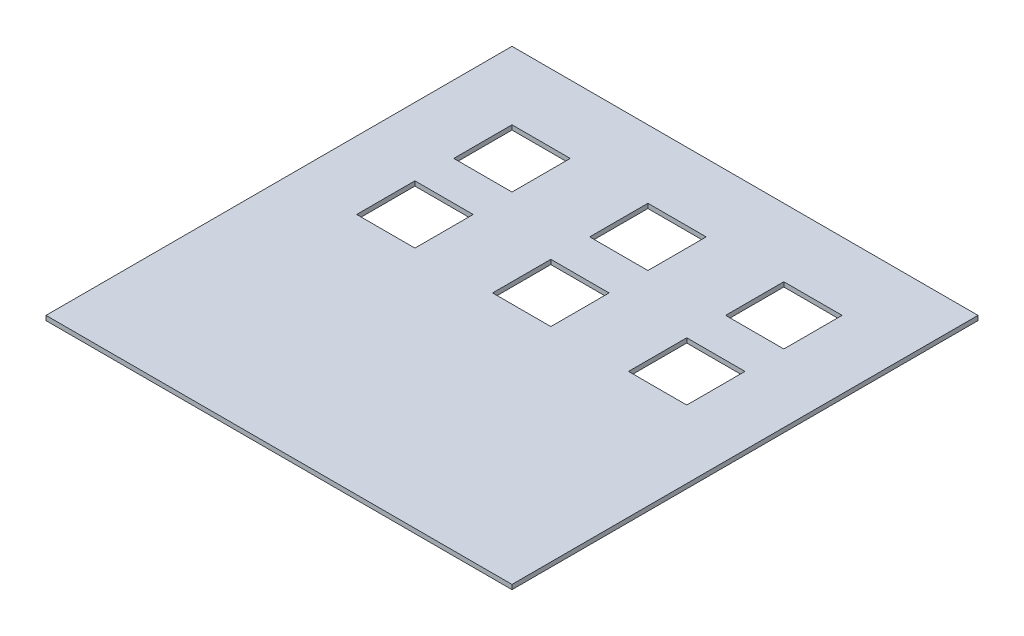
ISO-10303-21;
HEADER;
FILE_DESCRIPTION(('STEP AP214'),'2;1');
FILE_NAME('part.step','',(''),(''),'','','');
FILE_SCHEMA(('AUTOMOTIVE_DESIGN { 1 0 10303 214 1 1 1 1 }'));
ENDSEC;
DATA;
#1=APPLICATION_CONTEXT('core data for automotive mechanical design processes');
#2=APPLICATION_PROTOCOL_DEFINITION('international standard','automotive_design',2000,#1);
#3=PRODUCT_CONTEXT('',#1,'mechanical');
#4=PRODUCT('Part','Part','',(#3));
#5=PRODUCT_RELATED_PRODUCT_CATEGORY('part','',(#4));
#6=PRODUCT_DEFINITION_FORMATION('','',#4);
#7=PRODUCT_DEFINITION_CONTEXT('part definition',#1,'design');
#8=PRODUCT_DEFINITION('design','',#6,#7);
#9=PRODUCT_DEFINITION_SHAPE('','',#8);
#10=(LENGTH_UNIT() NAMED_UNIT(*) SI_UNIT(.MILLI.,.METRE.));
#11=(NAMED_UNIT(*) PLANE_ANGLE_UNIT() SI_UNIT($,.RADIAN.));
#12=(NAMED_UNIT(*) SI_UNIT($,.STERADIAN.) SOLID_ANGLE_UNIT());
#13=UNCERTAINTY_MEASURE_WITH_UNIT(LENGTH_MEASURE(1.E-05),#10,'distance_accuracy_value','');
#14=(GEOMETRIC_REPRESENTATION_CONTEXT(3) GLOBAL_UNCERTAINTY_ASSIGNED_CONTEXT((#13)) GLOBAL_UNIT_ASSIGNED_CONTEXT((#10,
#11,#12)) REPRESENTATION_CONTEXT('',''));
#15=CARTESIAN_POINT('',(0.,0.,0.));
#16=DIRECTION('',(0.,0.,1.));
#17=DIRECTION('',(1.,0.,0.));
#18=AXIS2_PLACEMENT_3D('',#15,#16,#17);
#19=CARTESIAN_POINT('',(69.8499999999999,0.,-44.45));
#20=DIRECTION('',(0.,0.,-1.));
#21=DIRECTION('',(-1.,0.,0.));
#22=AXIS2_PLACEMENT_3D('',#19,#20,#21);
#23=PLANE('',#22);
#24=DIRECTION('',(-1.,0.,0.));
#25=VECTOR('',#24,1.);
#26=CARTESIAN_POINT('',(69.8499999999999,2.9972,-44.45));
#27=LINE('',#26,#25);
#28=CARTESIAN_POINT('',(107.95,2.9972,-44.45));
#29=VERTEX_POINT('',#28);
#30=CARTESIAN_POINT('',(69.8499999999999,2.9972,-44.45));
#31=VERTEX_POINT('',#30);
#32=EDGE_CURVE('E507',#29,#31,#27,.T.);
#33=ORIENTED_EDGE('',*,*,#32,.T.);
#34=DIRECTION('',(0.,1.,0.));
#35=VECTOR('',#34,1.);
#36=CARTESIAN_POINT('',(69.8499999999999,0.,-44.45));
#37=LINE('',#36,#35);
#38=CARTESIAN_POINT('',(69.8499999999999,0.,-44.45));
#39=VERTEX_POINT('',#38);
#40=EDGE_CURVE('E11',#39,#31,#37,.T.);
#41=ORIENTED_EDGE('',*,*,#40,.F.);
#42=DIRECTION('',(-1.,0.,0.));
#43=VECTOR('',#42,1.);
#44=CARTESIAN_POINT('',(69.8499999999999,0.,-44.45));
#45=LINE('',#44,#43);
#46=CARTESIAN_POINT('',(107.95,0.,-44.45));
#47=VERTEX_POINT('',#46);
#48=EDGE_CURVE('E513',#47,#39,#45,.T.);
#49=ORIENTED_EDGE('',*,*,#48,.F.);
#50=DIRECTION('',(0.,1.,0.));
#51=VECTOR('',#50,1.);
#52=CARTESIAN_POINT('',(107.95,0.,-44.45));
#53=LINE('',#52,#51);
#54=EDGE_CURVE('E521',#47,#29,#53,.T.);
#55=ORIENTED_EDGE('',*,*,#54,.T.);
#56=EDGE_LOOP('',(#33,#41,#49,#55));
#57=FACE_BOUND('',#56,.T.);
#58=ADVANCED_FACE('F39',(#57),#23,.F.);
#59=CARTESIAN_POINT('',(69.8499999999999,0.,-6.34999999999999));
#60=DIRECTION('',(-1.,0.,0.));
#61=DIRECTION('',(0.,0.,1.));
#62=AXIS2_PLACEMENT_3D('',#59,#60,#61);
#63=PLANE('',#62);
#64=DIRECTION('',(0.,0.,1.));
#65=VECTOR('',#64,1.);
#66=CARTESIAN_POINT('',(69.8499999999999,2.9972,-6.34999999999999));
#67=LINE('',#66,#65);
#68=CARTESIAN_POINT('',(69.8499999999999,2.9972,-6.34999999999999));
#69=VERTEX_POINT('',#68);
#70=EDGE_CURVE('E503',#31,#69,#67,.T.);
#71=ORIENTED_EDGE('',*,*,#70,.T.);
#72=DIRECTION('',(0.,1.,0.));
#73=VECTOR('',#72,1.);
#74=CARTESIAN_POINT('',(69.8499999999999,0.,-6.34999999999999));
#75=LINE('',#74,#73);
#76=CARTESIAN_POINT('',(69.8499999999999,0.,-6.34999999999999));
#77=VERTEX_POINT('',#76);
#78=EDGE_CURVE('E47',#77,#69,#75,.T.);
#79=ORIENTED_EDGE('',*,*,#78,.F.);
#80=DIRECTION('',(0.,0.,1.));
#81=VECTOR('',#80,1.);
#82=CARTESIAN_POINT('',(69.8499999999999,0.,-6.34999999999999));
#83=LINE('',#82,#81);
#84=EDGE_CURVE('E61',#39,#77,#83,.T.);
#85=ORIENTED_EDGE('',*,*,#84,.F.);
#86=ORIENTED_EDGE('',*,*,#40,.T.);
#87=EDGE_LOOP('',(#71,#79,#85,#86));
#88=FACE_BOUND('',#87,.T.);
#89=ADVANCED_FACE('F534',(#88),#63,.F.);
#90=CARTESIAN_POINT('',(69.8499999999999,0.,-6.34999999999999));
#91=DIRECTION('',(0.,0.,1.));
#92=DIRECTION('',(1.,0.,0.));
#93=AXIS2_PLACEMENT_3D('',#90,#91,#92);
#94=PLANE('',#93);
#95=DIRECTION('',(1.,0.,0.));
#96=VECTOR('',#95,1.);
#97=CARTESIAN_POINT('',(69.8499999999999,2.9972,-6.34999999999999));
#98=LINE('',#97,#96);
#99=CARTESIAN_POINT('',(107.95,2.9972,-6.34999999999999));
#100=VERTEX_POINT('',#99);
#101=EDGE_CURVE('E499',#69,#100,#98,.T.);
#102=ORIENTED_EDGE('',*,*,#101,.T.);
#103=DIRECTION('',(0.,1.,0.));
#104=VECTOR('',#103,1.);
#105=CARTESIAN_POINT('',(107.95,0.,-6.34999999999999));
#106=LINE('',#105,#104);
#107=CARTESIAN_POINT('',(107.95,0.,-6.34999999999999));
#108=VERTEX_POINT('',#107);
#109=EDGE_CURVE('E525',#108,#100,#106,.T.);
#110=ORIENTED_EDGE('',*,*,#109,.F.);
#111=DIRECTION('',(1.,0.,0.));
#112=VECTOR('',#111,1.);
#113=CARTESIAN_POINT('',(69.8499999999999,0.,-6.34999999999999));
#114=LINE('',#113,#112);
#115=EDGE_CURVE('E518',#77,#108,#114,.T.);
#116=ORIENTED_EDGE('',*,*,#115,.F.);
#117=ORIENTED_EDGE('',*,*,#78,.T.);
#118=EDGE_LOOP('',(#102,#110,#116,#117));
#119=FACE_BOUND('',#118,.T.);
#120=ADVANCED_FACE('F531',(#119),#94,.F.);
#121=CARTESIAN_POINT('',(107.95,0.,-6.34999999999999));
#122=DIRECTION('',(1.,0.,0.));
#123=DIRECTION('',(0.,0.,-1.));
#124=AXIS2_PLACEMENT_3D('',#121,#122,#123);
#125=PLANE('',#124);
#126=DIRECTION('',(0.,0.,-1.));
#127=VECTOR('',#126,1.);
#128=CARTESIAN_POINT('',(107.95,2.9972,-6.34999999999999));
#129=LINE('',#128,#127);
#130=EDGE_CURVE('E496',#100,#29,#129,.T.);
#131=ORIENTED_EDGE('',*,*,#130,.T.);
#132=ORIENTED_EDGE('',*,*,#54,.F.);
#133=DIRECTION('',(0.,0.,-1.));
#134=VECTOR('',#133,1.);
#135=CARTESIAN_POINT('',(107.95,0.,-6.34999999999999));
#136=LINE('',#135,#134);
#137=EDGE_CURVE('E54',#108,#47,#136,.T.);
#138=ORIENTED_EDGE('',*,*,#137,.F.);
#139=ORIENTED_EDGE('',*,*,#109,.T.);
#140=EDGE_LOOP('',(#131,#132,#138,#139));
#141=FACE_BOUND('',#140,.T.);
#142=ADVANCED_FACE('F540',(#141),#125,.F.);
#143=CARTESIAN_POINT('',(-19.0500000000001,0.,-44.45));
#144=DIRECTION('',(0.,0.,-1.));
#145=DIRECTION('',(-1.,0.,0.));
#146=AXIS2_PLACEMENT_3D('',#143,#144,#145);
#147=PLANE('',#146);
#148=DIRECTION('',(-1.,0.,0.));
#149=VECTOR('',#148,1.);
#150=CARTESIAN_POINT('',(-19.0500000000001,2.9972,-44.45));
#151=LINE('',#150,#149);
#152=CARTESIAN_POINT('',(19.0499999999999,2.9972,-44.45));
#153=VERTEX_POINT('',#152);
#154=CARTESIAN_POINT('',(-19.0500000000001,2.9972,-44.45));
#155=VERTEX_POINT('',#154);
#156=EDGE_CURVE('E463',#153,#155,#151,.T.);
#157=ORIENTED_EDGE('',*,*,#156,.T.);
#158=DIRECTION('',(0.,1.,0.));
#159=VECTOR('',#158,1.);
#160=CARTESIAN_POINT('',(-19.0500000000001,0.,-44.45));
#161=LINE('',#160,#159);
#162=CARTESIAN_POINT('',(-19.0500000000001,0.,-44.45));
#163=VERTEX_POINT('',#162);
#164=EDGE_CURVE('E492',#163,#155,#161,.T.);
#165=ORIENTED_EDGE('',*,*,#164,.F.);
#166=DIRECTION('',(-1.,0.,0.));
#167=VECTOR('',#166,1.);
#168=CARTESIAN_POINT('',(-19.0500000000001,0.,-44.45));
#169=LINE('',#168,#167);
#170=CARTESIAN_POINT('',(19.0499999999999,0.,-44.45));
#171=VERTEX_POINT('',#170);
#172=EDGE_CURVE('E470',#171,#163,#169,.T.);
#173=ORIENTED_EDGE('',*,*,#172,.F.);
#174=DIRECTION('',(0.,1.,0.));
#175=VECTOR('',#174,1.);
#176=CARTESIAN_POINT('',(19.0499999999999,0.,-44.45));
#177=LINE('',#176,#175);
#178=EDGE_CURVE('E480',#171,#153,#177,.T.);
#179=ORIENTED_EDGE('',*,*,#178,.T.);
#180=EDGE_LOOP('',(#157,#165,#173,#179));
#181=FACE_BOUND('',#180,.T.);
#182=ADVANCED_FACE('F542',(#181),#147,.F.);
#183=CARTESIAN_POINT('',(-19.0500000000001,0.,-6.34999999999999));
#184=DIRECTION('',(-1.,0.,0.));
#185=DIRECTION('',(0.,0.,1.));
#186=AXIS2_PLACEMENT_3D('',#183,#184,#185);
#187=PLANE('',#186);
#188=DIRECTION('',(0.,0.,1.));
#189=VECTOR('',#188,1.);
#190=CARTESIAN_POINT('',(-19.0500000000001,2.9972,-6.34999999999999));
#191=LINE('',#190,#189);
#192=CARTESIAN_POINT('',(-19.0500000000001,2.9972,-6.34999999999999));
#193=VERTEX_POINT('',#192);
#194=EDGE_CURVE('E459',#155,#193,#191,.T.);
#195=ORIENTED_EDGE('',*,*,#194,.T.);
#196=DIRECTION('',(0.,1.,0.));
#197=VECTOR('',#196,1.);
#198=CARTESIAN_POINT('',(-19.0500000000001,0.,-6.34999999999999));
#199=LINE('',#198,#197);
#200=CARTESIAN_POINT('',(-19.0500000000001,0.,-6.34999999999999));
#201=VERTEX_POINT('',#200);
#202=EDGE_CURVE('E488',#201,#193,#199,.T.);
#203=ORIENTED_EDGE('',*,*,#202,.F.);
#204=DIRECTION('',(0.,0.,1.));
#205=VECTOR('',#204,1.);
#206=CARTESIAN_POINT('',(-19.0500000000001,0.,-6.34999999999999));
#207=LINE('',#206,#205);
#208=EDGE_CURVE('E473',#163,#201,#207,.T.);
#209=ORIENTED_EDGE('',*,*,#208,.F.);
#210=ORIENTED_EDGE('',*,*,#164,.T.);
#211=EDGE_LOOP('',(#195,#203,#209,#210));
#212=FACE_BOUND('',#211,.T.);
#213=ADVANCED_FACE('F548',(#212),#187,.F.);
#214=CARTESIAN_POINT('',(-19.0500000000001,0.,-6.34999999999999));
#215=DIRECTION('',(0.,0.,1.));
#216=DIRECTION('',(1.,0.,0.));
#217=AXIS2_PLACEMENT_3D('',#214,#215,#216);
#218=PLANE('',#217);
#219=DIRECTION('',(1.,0.,0.));
#220=VECTOR('',#219,1.);
#221=CARTESIAN_POINT('',(-19.0500000000001,2.9972,-6.34999999999999));
#222=LINE('',#221,#220);
#223=CARTESIAN_POINT('',(19.0499999999999,2.9972,-6.34999999999999));
#224=VERTEX_POINT('',#223);
#225=EDGE_CURVE('E455',#193,#224,#222,.T.);
#226=ORIENTED_EDGE('',*,*,#225,.T.);
#227=DIRECTION('',(0.,1.,0.));
#228=VECTOR('',#227,1.);
#229=CARTESIAN_POINT('',(19.0499999999999,0.,-6.34999999999999));
#230=LINE('',#229,#228);
#231=CARTESIAN_POINT('',(19.0499999999999,0.,-6.34999999999999));
#232=VERTEX_POINT('',#231);
#233=EDGE_CURVE('E484',#232,#224,#230,.T.);
#234=ORIENTED_EDGE('',*,*,#233,.F.);
#235=DIRECTION('',(1.,0.,0.));
#236=VECTOR('',#235,1.);
#237=CARTESIAN_POINT('',(-19.0500000000001,0.,-6.34999999999999));
#238=LINE('',#237,#236);
#239=EDGE_CURVE('E476',#201,#232,#238,.T.);
#240=ORIENTED_EDGE('',*,*,#239,.F.);
#241=ORIENTED_EDGE('',*,*,#202,.T.);
#242=EDGE_LOOP('',(#226,#234,#240,#241));
#243=FACE_BOUND('',#242,.T.);
#244=ADVANCED_FACE('F581',(#243),#218,.F.);
#245=CARTESIAN_POINT('',(19.0499999999999,0.,-6.34999999999999));
#246=DIRECTION('',(1.,0.,0.));
#247=DIRECTION('',(0.,0.,-1.));
#248=AXIS2_PLACEMENT_3D('',#245,#246,#247);
#249=PLANE('',#248);
#250=DIRECTION('',(0.,0.,-1.));
#251=VECTOR('',#250,1.);
#252=CARTESIAN_POINT('',(19.0499999999999,2.9972,-6.34999999999999));
#253=LINE('',#252,#251);
#254=EDGE_CURVE('E452',#224,#153,#253,.T.);
#255=ORIENTED_EDGE('',*,*,#254,.T.);
#256=ORIENTED_EDGE('',*,*,#178,.F.);
#257=DIRECTION('',(0.,0.,-1.));
#258=VECTOR('',#257,1.);
#259=CARTESIAN_POINT('',(19.0499999999999,0.,-6.34999999999999));
#260=LINE('',#259,#258);
#261=EDGE_CURVE('E467',#232,#171,#260,.T.);
#262=ORIENTED_EDGE('',*,*,#261,.F.);
#263=ORIENTED_EDGE('',*,*,#233,.T.);
#264=EDGE_LOOP('',(#255,#256,#262,#263));
#265=FACE_BOUND('',#264,.T.);
#266=ADVANCED_FACE('F591',(#265),#249,.F.);
#267=CARTESIAN_POINT('',(-107.95,0.,-44.45));
#268=DIRECTION('',(0.,0.,-1.));
#269=DIRECTION('',(-1.,0.,0.));
#270=AXIS2_PLACEMENT_3D('',#267,#268,#269);
#271=PLANE('',#270);
#272=DIRECTION('',(-1.,0.,0.));
#273=VECTOR('',#272,1.);
#274=CARTESIAN_POINT('',(-107.95,2.9972,-44.45));
#275=LINE('',#274,#273);
#276=CARTESIAN_POINT('',(-69.8500000000001,2.9972,-44.45));
#277=VERTEX_POINT('',#276);
#278=CARTESIAN_POINT('',(-107.95,2.9972,-44.45));
#279=VERTEX_POINT('',#278);
#280=EDGE_CURVE('E419',#277,#279,#275,.T.);
#281=ORIENTED_EDGE('',*,*,#280,.T.);
#282=DIRECTION('',(0.,1.,0.));
#283=VECTOR('',#282,1.);
#284=CARTESIAN_POINT('',(-107.95,0.,-44.45));
#285=LINE('',#284,#283);
#286=CARTESIAN_POINT('',(-107.95,0.,-44.45));
#287=VERTEX_POINT('',#286);
#288=EDGE_CURVE('E448',#287,#279,#285,.T.);
#289=ORIENTED_EDGE('',*,*,#288,.F.);
#290=DIRECTION('',(-1.,0.,0.));
#291=VECTOR('',#290,1.);
#292=CARTESIAN_POINT('',(-107.95,0.,-44.45));
#293=LINE('',#292,#291);
#294=CARTESIAN_POINT('',(-69.8500000000001,0.,-44.45));
#295=VERTEX_POINT('',#294);
#296=EDGE_CURVE('E426',#295,#287,#293,.T.);
#297=ORIENTED_EDGE('',*,*,#296,.F.);
#298=DIRECTION('',(0.,1.,0.));
#299=VECTOR('',#298,1.);
#300=CARTESIAN_POINT('',(-69.8500000000001,0.,-44.45));
#301=LINE('',#300,#299);
#302=EDGE_CURVE('E436',#295,#277,#301,.T.);
#303=ORIENTED_EDGE('',*,*,#302,.T.);
#304=EDGE_LOOP('',(#281,#289,#297,#303));
#305=FACE_BOUND('',#304,.T.);
#306=ADVANCED_FACE('F601',(#305),#271,.F.);
#307=CARTESIAN_POINT('',(-107.95,0.,-6.34999999999999));
#308=DIRECTION('',(-1.,0.,0.));
#309=DIRECTION('',(0.,0.,1.));
#310=AXIS2_PLACEMENT_3D('',#307,#308,#309);
#311=PLANE('',#310);
#312=DIRECTION('',(0.,0.,1.));
#313=VECTOR('',#312,1.);
#314=CARTESIAN_POINT('',(-107.95,2.9972,-6.34999999999999));
#315=LINE('',#314,#313);
#316=CARTESIAN_POINT('',(-107.95,2.9972,-6.34999999999999));
#317=VERTEX_POINT('',#316);
#318=EDGE_CURVE('E415',#279,#317,#315,.T.);
#319=ORIENTED_EDGE('',*,*,#318,.T.);
#320=DIRECTION('',(0.,1.,0.));
#321=VECTOR('',#320,1.);
#322=CARTESIAN_POINT('',(-107.95,0.,-6.34999999999999));
#323=LINE('',#322,#321);
#324=CARTESIAN_POINT('',(-107.95,0.,-6.34999999999999));
#325=VERTEX_POINT('',#324);
#326=EDGE_CURVE('E444',#325,#317,#323,.T.);
#327=ORIENTED_EDGE('',*,*,#326,.F.);
#328=DIRECTION('',(0.,0.,1.));
#329=VECTOR('',#328,1.);
#330=CARTESIAN_POINT('',(-107.95,0.,-6.34999999999999));
#331=LINE('',#330,#329);
#332=EDGE_CURVE('E429',#287,#325,#331,.T.);
#333=ORIENTED_EDGE('',*,*,#332,.F.);
#334=ORIENTED_EDGE('',*,*,#288,.T.);
#335=EDGE_LOOP('',(#319,#327,#333,#334));
#336=FACE_BOUND('',#335,.T.);
#337=ADVANCED_FACE('F611',(#336),#311,.F.);
#338=CARTESIAN_POINT('',(-107.95,0.,-6.34999999999999));
#339=DIRECTION('',(0.,0.,1.));
#340=DIRECTION('',(1.,0.,0.));
#341=AXIS2_PLACEMENT_3D('',#338,#339,#340);
#342=PLANE('',#341);
#343=DIRECTION('',(1.,0.,0.));
#344=VECTOR('',#343,1.);
#345=CARTESIAN_POINT('',(-107.95,2.9972,-6.34999999999999));
#346=LINE('',#345,#344);
#347=CARTESIAN_POINT('',(-69.8500000000001,2.9972,-6.34999999999999));
#348=VERTEX_POINT('',#347);
#349=EDGE_CURVE('E411',#317,#348,#346,.T.);
#350=ORIENTED_EDGE('',*,*,#349,.T.);
#351=DIRECTION('',(0.,1.,0.));
#352=VECTOR('',#351,1.);
#353=CARTESIAN_POINT('',(-69.8500000000001,0.,-6.34999999999999));
#354=LINE('',#353,#352);
#355=CARTESIAN_POINT('',(-69.8500000000001,0.,-6.34999999999999));
#356=VERTEX_POINT('',#355);
#357=EDGE_CURVE('E440',#356,#348,#354,.T.);
#358=ORIENTED_EDGE('',*,*,#357,.F.);
#359=DIRECTION('',(1.,0.,0.));
#360=VECTOR('',#359,1.);
#361=CARTESIAN_POINT('',(-107.95,0.,-6.34999999999999));
#362=LINE('',#361,#360);
#363=EDGE_CURVE('E432',#325,#356,#362,.T.);
#364=ORIENTED_EDGE('',*,*,#363,.F.);
#365=ORIENTED_EDGE('',*,*,#326,.T.);
#366=EDGE_LOOP('',(#350,#358,#364,#365));
#367=FACE_BOUND('',#366,.T.);
#368=ADVANCED_FACE('F621',(#367),#342,.F.);
#369=CARTESIAN_POINT('',(-69.8500000000001,0.,-6.34999999999999));
#370=DIRECTION('',(1.,0.,0.));
#371=DIRECTION('',(0.,0.,-1.));
#372=AXIS2_PLACEMENT_3D('',#369,#370,#371);
#373=PLANE('',#372);
#374=DIRECTION('',(0.,0.,-1.));
#375=VECTOR('',#374,1.);
#376=CARTESIAN_POINT('',(-69.8500000000001,2.9972,-6.34999999999999));
#377=LINE('',#376,#375);
#378=EDGE_CURVE('E408',#348,#277,#377,.T.);
#379=ORIENTED_EDGE('',*,*,#378,.T.);
#380=ORIENTED_EDGE('',*,*,#302,.F.);
#381=DIRECTION('',(0.,0.,-1.));
#382=VECTOR('',#381,1.);
#383=CARTESIAN_POINT('',(-69.8500000000001,0.,-6.34999999999999));
#384=LINE('',#383,#382);
#385=EDGE_CURVE('E423',#356,#295,#384,.T.);
#386=ORIENTED_EDGE('',*,*,#385,.F.);
#387=ORIENTED_EDGE('',*,*,#357,.T.);
#388=EDGE_LOOP('',(#379,#380,#386,#387));
#389=FACE_BOUND('',#388,.T.);
#390=ADVANCED_FACE('F631',(#389),#373,.F.);
#391=CARTESIAN_POINT('',(69.8499999999999,0.,-107.95));
#392=DIRECTION('',(0.,0.,-1.));
#393=DIRECTION('',(-1.,0.,0.));
#394=AXIS2_PLACEMENT_3D('',#391,#392,#393);
#395=PLANE('',#394);
#396=DIRECTION('',(-1.,0.,0.));
#397=VECTOR('',#396,1.);
#398=CARTESIAN_POINT('',(69.8499999999999,2.9972,-107.95));
#399=LINE('',#398,#397);
#400=CARTESIAN_POINT('',(107.95,2.9972,-107.95));
#401=VERTEX_POINT('',#400);
#402=CARTESIAN_POINT('',(69.8499999999999,2.9972,-107.95));
#403=VERTEX_POINT('',#402);
#404=EDGE_CURVE('E375',#401,#403,#399,.T.);
#405=ORIENTED_EDGE('',*,*,#404,.T.);
#406=DIRECTION('',(0.,1.,0.));
#407=VECTOR('',#406,1.);
#408=CARTESIAN_POINT('',(69.8499999999999,0.,-107.95));
#409=LINE('',#408,#407);
#410=CARTESIAN_POINT('',(69.8499999999999,0.,-107.95));
#411=VERTEX_POINT('',#410);
#412=EDGE_CURVE('E404',#411,#403,#409,.T.);
#413=ORIENTED_EDGE('',*,*,#412,.F.);
#414=DIRECTION('',(-1.,0.,0.));
#415=VECTOR('',#414,1.);
#416=CARTESIAN_POINT('',(69.8499999999999,0.,-107.95));
#417=LINE('',#416,#415);
#418=CARTESIAN_POINT('',(107.95,0.,-107.95));
#419=VERTEX_POINT('',#418);
#420=EDGE_CURVE('E382',#419,#411,#417,.T.);
#421=ORIENTED_EDGE('',*,*,#420,.F.);
#422=DIRECTION('',(0.,1.,0.));
#423=VECTOR('',#422,1.);
#424=CARTESIAN_POINT('',(107.95,0.,-107.95));
#425=LINE('',#424,#423);
#426=EDGE_CURVE('E392',#419,#401,#425,.T.);
#427=ORIENTED_EDGE('',*,*,#426,.T.);
#428=EDGE_LOOP('',(#405,#413,#421,#427));
#429=FACE_BOUND('',#428,.T.);
#430=ADVANCED_FACE('F641',(#429),#395,.F.);
#431=CARTESIAN_POINT('',(69.8499999999999,0.,-69.85));
#432=DIRECTION('',(-1.,0.,0.));
#433=DIRECTION('',(0.,0.,1.));
#434=AXIS2_PLACEMENT_3D('',#431,#432,#433);
#435=PLANE('',#434);
#436=DIRECTION('',(0.,0.,1.));
#437=VECTOR('',#436,1.);
#438=CARTESIAN_POINT('',(69.8499999999999,2.9972,-69.85));
#439=LINE('',#438,#437);
#440=CARTESIAN_POINT('',(69.8499999999999,2.9972,-69.85));
#441=VERTEX_POINT('',#440);
#442=EDGE_CURVE('E371',#403,#441,#439,.T.);
#443=ORIENTED_EDGE('',*,*,#442,.T.);
#444=DIRECTION('',(0.,1.,0.));
#445=VECTOR('',#444,1.);
#446=CARTESIAN_POINT('',(69.8499999999999,0.,-69.85));
#447=LINE('',#446,#445);
#448=CARTESIAN_POINT('',(69.8499999999999,0.,-69.85));
#449=VERTEX_POINT('',#448);
#450=EDGE_CURVE('E400',#449,#441,#447,.T.);
#451=ORIENTED_EDGE('',*,*,#450,.F.);
#452=DIRECTION('',(0.,0.,1.));
#453=VECTOR('',#452,1.);
#454=CARTESIAN_POINT('',(69.8499999999999,0.,-69.85));
#455=LINE('',#454,#453);
#456=EDGE_CURVE('E385',#411,#449,#455,.T.);
#457=ORIENTED_EDGE('',*,*,#456,.F.);
#458=ORIENTED_EDGE('',*,*,#412,.T.);
#459=EDGE_LOOP('',(#443,#451,#457,#458));
#460=FACE_BOUND('',#459,.T.);
#461=ADVANCED_FACE('F651',(#460),#435,.F.);
#462=CARTESIAN_POINT('',(69.8499999999999,0.,-69.85));
#463=DIRECTION('',(0.,0.,1.));
#464=DIRECTION('',(1.,0.,0.));
#465=AXIS2_PLACEMENT_3D('',#462,#463,#464);
#466=PLANE('',#465);
#467=DIRECTION('',(1.,0.,0.));
#468=VECTOR('',#467,1.);
#469=CARTESIAN_POINT('',(69.8499999999999,2.9972,-69.85));
#470=LINE('',#469,#468);
#471=CARTESIAN_POINT('',(107.95,2.9972,-69.85));
#472=VERTEX_POINT('',#471);
#473=EDGE_CURVE('E367',#441,#472,#470,.T.);
#474=ORIENTED_EDGE('',*,*,#473,.T.);
#475=DIRECTION('',(0.,1.,0.));
#476=VECTOR('',#475,1.);
#477=CARTESIAN_POINT('',(107.95,0.,-69.85));
#478=LINE('',#477,#476);
#479=CARTESIAN_POINT('',(107.95,0.,-69.85));
#480=VERTEX_POINT('',#479);
#481=EDGE_CURVE('E396',#480,#472,#478,.T.);
#482=ORIENTED_EDGE('',*,*,#481,.F.);
#483=DIRECTION('',(1.,0.,0.));
#484=VECTOR('',#483,1.);
#485=CARTESIAN_POINT('',(69.8499999999999,0.,-69.85));
#486=LINE('',#485,#484);
#487=EDGE_CURVE('E388',#449,#480,#486,.T.);
#488=ORIENTED_EDGE('',*,*,#487,.F.);
#489=ORIENTED_EDGE('',*,*,#450,.T.);
#490=EDGE_LOOP('',(#474,#482,#488,#489));
#491=FACE_BOUND('',#490,.T.);
#492=ADVANCED_FACE('F661',(#491),#466,.F.);
#493=CARTESIAN_POINT('',(107.95,0.,-69.85));
#494=DIRECTION('',(1.,0.,0.));
#495=DIRECTION('',(0.,0.,-1.));
#496=AXIS2_PLACEMENT_3D('',#493,#494,#495);
#497=PLANE('',#496);
#498=DIRECTION('',(0.,0.,-1.));
#499=VECTOR('',#498,1.);
#500=CARTESIAN_POINT('',(107.95,2.9972,-69.85));
#501=LINE('',#500,#499);
#502=EDGE_CURVE('E364',#472,#401,#501,.T.);
#503=ORIENTED_EDGE('',*,*,#502,.T.);
#504=ORIENTED_EDGE('',*,*,#426,.F.);
#505=DIRECTION('',(0.,0.,-1.));
#506=VECTOR('',#505,1.);
#507=CARTESIAN_POINT('',(107.95,0.,-69.85));
#508=LINE('',#507,#506);
#509=EDGE_CURVE('E379',#480,#419,#508,.T.);
#510=ORIENTED_EDGE('',*,*,#509,.F.);
#511=ORIENTED_EDGE('',*,*,#481,.T.);
#512=EDGE_LOOP('',(#503,#504,#510,#511));
#513=FACE_BOUND('',#512,.T.);
#514=ADVANCED_FACE('F671',(#513),#497,.F.);
#515=CARTESIAN_POINT('',(152.4,2.9972,152.4));
#516=DIRECTION('',(-1.,0.,0.));
#517=DIRECTION('',(0.,0.,1.));
#518=AXIS2_PLACEMENT_3D('',#515,#516,#517);
#519=PLANE('',#518);
#520=DIRECTION('',(0.,0.,-1.));
#521=VECTOR('',#520,1.);
#522=CARTESIAN_POINT('',(152.4,0.,152.4));
#523=LINE('',#522,#521);
#524=CARTESIAN_POINT('',(152.4,0.,152.4));
#525=VERTEX_POINT('',#524);
#526=CARTESIAN_POINT('',(152.4,0.,-152.4));
#527=VERTEX_POINT('',#526);
#528=EDGE_CURVE('E313',#525,#527,#523,.T.);
#529=ORIENTED_EDGE('',*,*,#528,.T.);
#530=DIRECTION('',(0.,-1.,0.));
#531=VECTOR('',#530,1.);
#532=CARTESIAN_POINT('',(152.4,2.9972,-152.4));
#533=LINE('',#532,#531);
#534=CARTESIAN_POINT('',(152.4,2.9972,-152.4));
#535=VERTEX_POINT('',#534);
#536=EDGE_CURVE('E360',#535,#527,#533,.T.);
#537=ORIENTED_EDGE('',*,*,#536,.F.);
#538=DIRECTION('',(0.,0.,-1.));
#539=VECTOR('',#538,1.);
#540=CARTESIAN_POINT('',(152.4,2.9972,152.4));
#541=LINE('',#540,#539);
#542=CARTESIAN_POINT('',(152.4,2.9972,152.4));
#543=VERTEX_POINT('',#542);
#544=EDGE_CURVE('E323',#543,#535,#541,.T.);
#545=ORIENTED_EDGE('',*,*,#544,.F.);
#546=DIRECTION('',(0.,-1.,0.));
#547=VECTOR('',#546,1.);
#548=CARTESIAN_POINT('',(152.4,2.9972,152.4));
#549=LINE('',#548,#547);
#550=EDGE_CURVE('E337',#543,#525,#549,.T.);
#551=ORIENTED_EDGE('',*,*,#550,.T.);
#552=EDGE_LOOP('',(#529,#537,#545,#551));
#553=FACE_BOUND('',#552,.T.);
#554=ADVANCED_FACE('F681',(#553),#519,.F.);
#555=CARTESIAN_POINT('',(-152.4,2.9972,-152.4));
#556=DIRECTION('',(0.,0.,1.));
#557=DIRECTION('',(1.,0.,0.));
#558=AXIS2_PLACEMENT_3D('',#555,#556,#557);
#559=PLANE('',#558);
#560=DIRECTION('',(-1.,0.,0.));
#561=VECTOR('',#560,1.);
#562=CARTESIAN_POINT('',(-152.4,0.,-152.4));
#563=LINE('',#562,#561);
#564=CARTESIAN_POINT('',(-152.4,0.,-152.4));
#565=VERTEX_POINT('',#564);
#566=EDGE_CURVE('E341',#527,#565,#563,.T.);
#567=ORIENTED_EDGE('',*,*,#566,.T.);
#568=DIRECTION('',(0.,-1.,0.));
#569=VECTOR('',#568,1.);
#570=CARTESIAN_POINT('',(-152.4,2.9972,-152.4));
#571=LINE('',#570,#569);
#572=CARTESIAN_POINT('',(-152.4,2.9972,-152.4));
#573=VERTEX_POINT('',#572);
#574=EDGE_CURVE('E356',#573,#565,#571,.T.);
#575=ORIENTED_EDGE('',*,*,#574,.F.);
#576=DIRECTION('',(-1.,0.,0.));
#577=VECTOR('',#576,1.);
#578=CARTESIAN_POINT('',(-152.4,2.9972,-152.4));
#579=LINE('',#578,#577);
#580=EDGE_CURVE('E327',#535,#573,#579,.T.);
#581=ORIENTED_EDGE('',*,*,#580,.F.);
#582=ORIENTED_EDGE('',*,*,#536,.T.);
#583=EDGE_LOOP('',(#567,#575,#581,#582));
#584=FACE_BOUND('',#583,.T.);
#585=ADVANCED_FACE('F767',(#584),#559,.F.);
#586=CARTESIAN_POINT('',(-152.4,2.9972,152.4));
#587=DIRECTION('',(1.,0.,0.));
#588=DIRECTION('',(0.,0.,-1.));
#589=AXIS2_PLACEMENT_3D('',#586,#587,#588);
#590=PLANE('',#589);
#591=DIRECTION('',(0.,0.,1.));
#592=VECTOR('',#591,1.);
#593=CARTESIAN_POINT('',(-152.4,0.,152.4));
#594=LINE('',#593,#592);
#595=CARTESIAN_POINT('',(-152.4,0.,152.4));
#596=VERTEX_POINT('',#595);
#597=EDGE_CURVE('E344',#565,#596,#594,.T.);
#598=ORIENTED_EDGE('',*,*,#597,.T.);
#599=DIRECTION('',(0.,-1.,0.));
#600=VECTOR('',#599,1.);
#601=CARTESIAN_POINT('',(-152.4,2.9972,152.4));
#602=LINE('',#601,#600);
#603=CARTESIAN_POINT('',(-152.4,2.9972,152.4));
#604=VERTEX_POINT('',#603);
#605=EDGE_CURVE('E352',#604,#596,#602,.T.);
#606=ORIENTED_EDGE('',*,*,#605,.F.);
#607=DIRECTION('',(0.,0.,1.));
#608=VECTOR('',#607,1.);
#609=CARTESIAN_POINT('',(-152.4,2.9972,152.4));
#610=LINE('',#609,#608);
#611=EDGE_CURVE('E331',#573,#604,#610,.T.);
#612=ORIENTED_EDGE('',*,*,#611,.F.);
#613=ORIENTED_EDGE('',*,*,#574,.T.);
#614=EDGE_LOOP('',(#598,#606,#612,#613));
#615=FACE_BOUND('',#614,.T.);
#616=ADVANCED_FACE('F763',(#615),#590,.F.);
#617=CARTESIAN_POINT('',(-152.4,2.9972,152.4));
#618=DIRECTION('',(0.,0.,-1.));
#619=DIRECTION('',(-1.,0.,0.));
#620=AXIS2_PLACEMENT_3D('',#617,#618,#619);
#621=PLANE('',#620);
#622=DIRECTION('',(1.,0.,0.));
#623=VECTOR('',#622,1.);
#624=CARTESIAN_POINT('',(-152.4,0.,152.4));
#625=LINE('',#624,#623);
#626=EDGE_CURVE('E328',#596,#525,#625,.T.);
#627=ORIENTED_EDGE('',*,*,#626,.T.);
#628=ORIENTED_EDGE('',*,*,#550,.F.);
#629=DIRECTION('',(1.,0.,0.));
#630=VECTOR('',#629,1.);
#631=CARTESIAN_POINT('',(-152.4,2.9972,152.4));
#632=LINE('',#631,#630);
#633=EDGE_CURVE('E334',#604,#543,#632,.T.);
#634=ORIENTED_EDGE('',*,*,#633,.F.);
#635=ORIENTED_EDGE('',*,*,#605,.T.);
#636=EDGE_LOOP('',(#627,#628,#634,#635));
#637=FACE_BOUND('',#636,.T.);
#638=ADVANCED_FACE('F694',(#637),#621,.F.);
#639=CARTESIAN_POINT('',(0.,2.9972,0.));
#640=DIRECTION('',(0.,-1.,0.));
#641=DIRECTION('',(0.,0.,-1.));
#642=AXIS2_PLACEMENT_3D('',#639,#640,#641);
#643=PLANE('',#642);
#644=DIRECTION('',(-1.,0.,0.));
#645=VECTOR('',#644,1.);
#646=CARTESIAN_POINT('',(-19.0500000000001,2.9972,-107.95));
#647=LINE('',#646,#645);
#648=CARTESIAN_POINT('',(19.0499999999999,2.9972,-107.95));
#649=VERTEX_POINT('',#648);
#650=CARTESIAN_POINT('',(-19.0500000000001,2.9972,-107.95));
#651=VERTEX_POINT('',#650);
#652=EDGE_CURVE('E226',#649,#651,#647,.T.);
#653=ORIENTED_EDGE('',*,*,#652,.F.);
#654=DIRECTION('',(0.,0.,-1.));
#655=VECTOR('',#654,1.);
#656=CARTESIAN_POINT('',(19.0499999999999,2.9972,-69.85));
#657=LINE('',#656,#655);
#658=CARTESIAN_POINT('',(19.0499999999999,2.9972,-69.85));
#659=VERTEX_POINT('',#658);
#660=EDGE_CURVE('E271',#659,#649,#657,.T.);
#661=ORIENTED_EDGE('',*,*,#660,.F.);
#662=DIRECTION('',(1.,0.,0.));
#663=VECTOR('',#662,1.);
#664=CARTESIAN_POINT('',(-19.0500000000001,2.9972,-69.85));
#665=LINE('',#664,#663);
#666=CARTESIAN_POINT('',(-19.0500000000001,2.9972,-69.85));
#667=VERTEX_POINT('',#666);
#668=EDGE_CURVE('E250',#667,#659,#665,.T.);
#669=ORIENTED_EDGE('',*,*,#668,.F.);
#670=DIRECTION('',(0.,0.,1.));
#671=VECTOR('',#670,1.);
#672=CARTESIAN_POINT('',(-19.0500000000001,2.9972,-69.85));
#673=LINE('',#672,#671);
#674=EDGE_CURVE('E241',#651,#667,#673,.T.);
#675=ORIENTED_EDGE('',*,*,#674,.F.);
#676=EDGE_LOOP('',(#653,#661,#669,#675));
#677=FACE_BOUND('',#676,.T.);
#678=DIRECTION('',(-1.,0.,0.));
#679=VECTOR('',#678,1.);
#680=CARTESIAN_POINT('',(-107.95,2.9972,-107.95));
#681=LINE('',#680,#679);
#682=CARTESIAN_POINT('',(-69.8500000000001,2.9972,-107.95));
#683=VERTEX_POINT('',#682);
#684=CARTESIAN_POINT('',(-107.95,2.9972,-107.95));
#685=VERTEX_POINT('',#684);
#686=EDGE_CURVE('E299',#683,#685,#681,.T.);
#687=ORIENTED_EDGE('',*,*,#686,.F.);
#688=DIRECTION('',(0.,0.,-1.));
#689=VECTOR('',#688,1.);
#690=CARTESIAN_POINT('',(-69.8500000000001,2.9972,-69.85));
#691=LINE('',#690,#689);
#692=CARTESIAN_POINT('',(-69.8500000000001,2.9972,-69.85));
#693=VERTEX_POINT('',#692);
#694=EDGE_CURVE('E278',#693,#683,#691,.T.);
#695=ORIENTED_EDGE('',*,*,#694,.F.);
#696=DIRECTION('',(1.,0.,0.));
#697=VECTOR('',#696,1.);
#698=CARTESIAN_POINT('',(-107.95,2.9972,-69.85));
#699=LINE('',#698,#697);
#700=CARTESIAN_POINT('',(-107.95,2.9972,-69.85));
#701=VERTEX_POINT('',#700);
#702=EDGE_CURVE('E284',#701,#693,#699,.T.);
#703=ORIENTED_EDGE('',*,*,#702,.F.);
#704=DIRECTION('',(0.,0.,1.));
#705=VECTOR('',#704,1.);
#706=CARTESIAN_POINT('',(-107.95,2.9972,-69.85));
#707=LINE('',#706,#705);
#708=EDGE_CURVE('E303',#685,#701,#707,.T.);
#709=ORIENTED_EDGE('',*,*,#708,.F.);
#710=EDGE_LOOP('',(#687,#695,#703,#709));
#711=FACE_BOUND('',#710,.T.);
#712=ORIENTED_EDGE('',*,*,#544,.T.);
#713=ORIENTED_EDGE('',*,*,#580,.T.);
#714=ORIENTED_EDGE('',*,*,#611,.T.);
#715=ORIENTED_EDGE('',*,*,#633,.T.);
#716=EDGE_LOOP('',(#712,#713,#714,#715));
#717=FACE_BOUND('',#716,.T.);
#718=ORIENTED_EDGE('',*,*,#502,.F.);
#719=ORIENTED_EDGE('',*,*,#473,.F.);
#720=ORIENTED_EDGE('',*,*,#442,.F.);
#721=ORIENTED_EDGE('',*,*,#404,.F.);
#722=EDGE_LOOP('',(#718,#719,#720,#721));
#723=FACE_BOUND('',#722,.T.);
#724=ORIENTED_EDGE('',*,*,#378,.F.);
#725=ORIENTED_EDGE('',*,*,#349,.F.);
#726=ORIENTED_EDGE('',*,*,#318,.F.);
#727=ORIENTED_EDGE('',*,*,#280,.F.);
#728=EDGE_LOOP('',(#724,#725,#726,#727));
#729=FACE_BOUND('',#728,.T.);
#730=ORIENTED_EDGE('',*,*,#254,.F.);
#731=ORIENTED_EDGE('',*,*,#225,.F.);
#732=ORIENTED_EDGE('',*,*,#194,.F.);
#733=ORIENTED_EDGE('',*,*,#156,.F.);
#734=EDGE_LOOP('',(#730,#731,#732,#733));
#735=FACE_BOUND('',#734,.T.);
#736=ORIENTED_EDGE('',*,*,#130,.F.);
#737=ORIENTED_EDGE('',*,*,#101,.F.);
#738=ORIENTED_EDGE('',*,*,#70,.F.);
#739=ORIENTED_EDGE('',*,*,#32,.F.);
#740=EDGE_LOOP('',(#736,#737,#738,#739));
#741=FACE_BOUND('',#740,.T.);
#742=ADVANCED_FACE('F248',(#677,#711,#717,#723,#729,#735,#741),#643,.F.);
#743=CARTESIAN_POINT('',(0.,0.,0.));
#744=DIRECTION('',(0.,-1.,0.));
#745=DIRECTION('',(0.,0.,-1.));
#746=AXIS2_PLACEMENT_3D('',#743,#744,#745);
#747=PLANE('',#746);
#748=DIRECTION('',(0.,0.,-1.));
#749=VECTOR('',#748,1.);
#750=CARTESIAN_POINT('',(19.0499999999999,0.,-69.85));
#751=LINE('',#750,#749);
#752=CARTESIAN_POINT('',(19.0499999999999,0.,-69.85));
#753=VERTEX_POINT('',#752);
#754=CARTESIAN_POINT('',(19.0499999999999,0.,-107.95));
#755=VERTEX_POINT('',#754);
#756=EDGE_CURVE('E274',#753,#755,#751,.T.);
#757=ORIENTED_EDGE('',*,*,#756,.T.);
#758=DIRECTION('',(-1.,0.,0.));
#759=VECTOR('',#758,1.);
#760=CARTESIAN_POINT('',(-19.0500000000001,0.,-107.95));
#761=LINE('',#760,#759);
#762=CARTESIAN_POINT('',(-19.0500000000001,0.,-107.95));
#763=VERTEX_POINT('',#762);
#764=EDGE_CURVE('E237',#755,#763,#761,.T.);
#765=ORIENTED_EDGE('',*,*,#764,.T.);
#766=DIRECTION('',(0.,0.,1.));
#767=VECTOR('',#766,1.);
#768=CARTESIAN_POINT('',(-19.0500000000001,0.,-69.85));
#769=LINE('',#768,#767);
#770=CARTESIAN_POINT('',(-19.0500000000001,0.,-69.85));
#771=VERTEX_POINT('',#770);
#772=EDGE_CURVE('E244',#763,#771,#769,.T.);
#773=ORIENTED_EDGE('',*,*,#772,.T.);
#774=DIRECTION('',(1.,0.,0.));
#775=VECTOR('',#774,1.);
#776=CARTESIAN_POINT('',(-19.0500000000001,0.,-69.85));
#777=LINE('',#776,#775);
#778=EDGE_CURVE('E267',#771,#753,#777,.T.);
#779=ORIENTED_EDGE('',*,*,#778,.T.);
#780=EDGE_LOOP('',(#757,#765,#773,#779));
#781=FACE_BOUND('',#780,.T.);
#782=DIRECTION('',(0.,0.,-1.));
#783=VECTOR('',#782,1.);
#784=CARTESIAN_POINT('',(-69.8500000000001,0.,-69.85));
#785=LINE('',#784,#783);
#786=CARTESIAN_POINT('',(-69.8500000000001,0.,-69.85));
#787=VERTEX_POINT('',#786);
#788=CARTESIAN_POINT('',(-69.8500000000001,0.,-107.95));
#789=VERTEX_POINT('',#788);
#790=EDGE_CURVE('E279',#787,#789,#785,.T.);
#791=ORIENTED_EDGE('',*,*,#790,.T.);
#792=DIRECTION('',(-1.,0.,0.));
#793=VECTOR('',#792,1.);
#794=CARTESIAN_POINT('',(-107.95,0.,-107.95));
#795=LINE('',#794,#793);
#796=CARTESIAN_POINT('',(-107.95,0.,-107.95));
#797=VERTEX_POINT('',#796);
#798=EDGE_CURVE('E283',#789,#797,#795,.T.);
#799=ORIENTED_EDGE('',*,*,#798,.T.);
#800=DIRECTION('',(0.,0.,1.));
#801=VECTOR('',#800,1.);
#802=CARTESIAN_POINT('',(-107.95,0.,-69.85));
#803=LINE('',#802,#801);
#804=CARTESIAN_POINT('',(-107.95,0.,-69.85));
#805=VERTEX_POINT('',#804);
#806=EDGE_CURVE('E288',#797,#805,#803,.T.);
#807=ORIENTED_EDGE('',*,*,#806,.T.);
#808=DIRECTION('',(1.,0.,0.));
#809=VECTOR('',#808,1.);
#810=CARTESIAN_POINT('',(-107.95,0.,-69.85));
#811=LINE('',#810,#809);
#812=EDGE_CURVE('E292',#805,#787,#811,.T.);
#813=ORIENTED_EDGE('',*,*,#812,.T.);
#814=EDGE_LOOP('',(#791,#799,#807,#813));
#815=FACE_BOUND('',#814,.T.);
#816=ORIENTED_EDGE('',*,*,#528,.F.);
#817=ORIENTED_EDGE('',*,*,#626,.F.);
#818=ORIENTED_EDGE('',*,*,#597,.F.);
#819=ORIENTED_EDGE('',*,*,#566,.F.);
#820=EDGE_LOOP('',(#816,#817,#818,#819));
#821=FACE_BOUND('',#820,.T.);
#822=ORIENTED_EDGE('',*,*,#509,.T.);
#823=ORIENTED_EDGE('',*,*,#420,.T.);
#824=ORIENTED_EDGE('',*,*,#456,.T.);
#825=ORIENTED_EDGE('',*,*,#487,.T.);
#826=EDGE_LOOP('',(#822,#823,#824,#825));
#827=FACE_BOUND('',#826,.T.);
#828=ORIENTED_EDGE('',*,*,#385,.T.);
#829=ORIENTED_EDGE('',*,*,#296,.T.);
#830=ORIENTED_EDGE('',*,*,#332,.T.);
#831=ORIENTED_EDGE('',*,*,#363,.T.);
#832=EDGE_LOOP('',(#828,#829,#830,#831));
#833=FACE_BOUND('',#832,.T.);
#834=ORIENTED_EDGE('',*,*,#261,.T.);
#835=ORIENTED_EDGE('',*,*,#172,.T.);
#836=ORIENTED_EDGE('',*,*,#208,.T.);
#837=ORIENTED_EDGE('',*,*,#239,.T.);
#838=EDGE_LOOP('',(#834,#835,#836,#837));
#839=FACE_BOUND('',#838,.T.);
#840=ORIENTED_EDGE('',*,*,#137,.T.);
#841=ORIENTED_EDGE('',*,*,#48,.T.);
#842=ORIENTED_EDGE('',*,*,#84,.T.);
#843=ORIENTED_EDGE('',*,*,#115,.T.);
#844=EDGE_LOOP('',(#840,#841,#842,#843));
#845=FACE_BOUND('',#844,.T.);
#846=ADVANCED_FACE('F693',(#781,#815,#821,#827,#833,#839,#845),#747,.T.);
#847=CARTESIAN_POINT('',(-69.8500000000001,0.,-69.85));
#848=DIRECTION('',(1.,0.,0.));
#849=DIRECTION('',(0.,0.,-1.));
#850=AXIS2_PLACEMENT_3D('',#847,#848,#849);
#851=PLANE('',#850);
#852=ORIENTED_EDGE('',*,*,#694,.T.);
#853=DIRECTION('',(0.,1.,0.));
#854=VECTOR('',#853,1.);
#855=CARTESIAN_POINT('',(-69.8500000000001,0.,-107.95));
#856=LINE('',#855,#854);
#857=EDGE_CURVE('E296',#789,#683,#856,.T.);
#858=ORIENTED_EDGE('',*,*,#857,.F.);
#859=ORIENTED_EDGE('',*,*,#790,.F.);
#860=DIRECTION('',(0.,1.,0.));
#861=VECTOR('',#860,1.);
#862=CARTESIAN_POINT('',(-69.8500000000001,0.,-69.85));
#863=LINE('',#862,#861);
#864=EDGE_CURVE('E310',#787,#693,#863,.T.);
#865=ORIENTED_EDGE('',*,*,#864,.T.);
#866=EDGE_LOOP('',(#852,#858,#859,#865));
#867=FACE_BOUND('',#866,.T.);
#868=ADVANCED_FACE('F705',(#867),#851,.F.);
#869=CARTESIAN_POINT('',(-107.95,0.,-69.85));
#870=DIRECTION('',(0.,0.,1.));
#871=DIRECTION('',(1.,0.,0.));
#872=AXIS2_PLACEMENT_3D('',#869,#870,#871);
#873=PLANE('',#872);
#874=ORIENTED_EDGE('',*,*,#702,.T.);
#875=ORIENTED_EDGE('',*,*,#864,.F.);
#876=ORIENTED_EDGE('',*,*,#812,.F.);
#877=DIRECTION('',(0.,1.,0.));
#878=VECTOR('',#877,1.);
#879=CARTESIAN_POINT('',(-107.95,0.,-69.85));
#880=LINE('',#879,#878);
#881=EDGE_CURVE('E314',#805,#701,#880,.T.);
#882=ORIENTED_EDGE('',*,*,#881,.T.);
#883=EDGE_LOOP('',(#874,#875,#876,#882));
#884=FACE_BOUND('',#883,.T.);
#885=ADVANCED_FACE('F750',(#884),#873,.F.);
#886=CARTESIAN_POINT('',(-107.95,0.,-69.85));
#887=DIRECTION('',(-1.,0.,0.));
#888=DIRECTION('',(0.,0.,1.));
#889=AXIS2_PLACEMENT_3D('',#886,#887,#888);
#890=PLANE('',#889);
#891=ORIENTED_EDGE('',*,*,#708,.T.);
#892=ORIENTED_EDGE('',*,*,#881,.F.);
#893=ORIENTED_EDGE('',*,*,#806,.F.);
#894=DIRECTION('',(0.,1.,0.));
#895=VECTOR('',#894,1.);
#896=CARTESIAN_POINT('',(-107.95,0.,-107.95));
#897=LINE('',#896,#895);
#898=EDGE_CURVE('E317',#797,#685,#897,.T.);
#899=ORIENTED_EDGE('',*,*,#898,.T.);
#900=EDGE_LOOP('',(#891,#892,#893,#899));
#901=FACE_BOUND('',#900,.T.);
#902=ADVANCED_FACE('F753',(#901),#890,.F.);
#903=CARTESIAN_POINT('',(-107.95,0.,-107.95));
#904=DIRECTION('',(0.,0.,-1.));
#905=DIRECTION('',(-1.,0.,0.));
#906=AXIS2_PLACEMENT_3D('',#903,#904,#905);
#907=PLANE('',#906);
#908=ORIENTED_EDGE('',*,*,#686,.T.);
#909=ORIENTED_EDGE('',*,*,#898,.F.);
#910=ORIENTED_EDGE('',*,*,#798,.F.);
#911=ORIENTED_EDGE('',*,*,#857,.T.);
#912=EDGE_LOOP('',(#908,#909,#910,#911));
#913=FACE_BOUND('',#912,.T.);
#914=ADVANCED_FACE('F718',(#913),#907,.F.);
#915=CARTESIAN_POINT('',(19.0499999999999,0.,-69.85));
#916=DIRECTION('',(1.,0.,0.));
#917=DIRECTION('',(0.,0.,-1.));
#918=AXIS2_PLACEMENT_3D('',#915,#916,#917);
#919=PLANE('',#918);
#920=ORIENTED_EDGE('',*,*,#660,.T.);
#921=DIRECTION('',(0.,1.,0.));
#922=VECTOR('',#921,1.);
#923=CARTESIAN_POINT('',(19.0499999999999,0.,-107.95));
#924=LINE('',#923,#922);
#925=EDGE_CURVE('E232',#755,#649,#924,.T.);
#926=ORIENTED_EDGE('',*,*,#925,.F.);
#927=ORIENTED_EDGE('',*,*,#756,.F.);
#928=DIRECTION('',(0.,1.,0.));
#929=VECTOR('',#928,1.);
#930=CARTESIAN_POINT('',(19.0499999999999,0.,-69.85));
#931=LINE('',#930,#929);
#932=EDGE_CURVE('E263',#753,#659,#931,.T.);
#933=ORIENTED_EDGE('',*,*,#932,.T.);
#934=EDGE_LOOP('',(#920,#926,#927,#933));
#935=FACE_BOUND('',#934,.T.);
#936=ADVANCED_FACE('F713',(#935),#919,.F.);
#937=CARTESIAN_POINT('',(-19.0500000000001,0.,-69.85));
#938=DIRECTION('',(0.,0.,1.));
#939=DIRECTION('',(1.,0.,0.));
#940=AXIS2_PLACEMENT_3D('',#937,#938,#939);
#941=PLANE('',#940);
#942=ORIENTED_EDGE('',*,*,#668,.T.);
#943=ORIENTED_EDGE('',*,*,#932,.F.);
#944=ORIENTED_EDGE('',*,*,#778,.F.);
#945=DIRECTION('',(0.,1.,0.));
#946=VECTOR('',#945,1.);
#947=CARTESIAN_POINT('',(-19.0500000000001,0.,-69.85));
#948=LINE('',#947,#946);
#949=EDGE_CURVE('E252',#771,#667,#948,.T.);
#950=ORIENTED_EDGE('',*,*,#949,.T.);
#951=EDGE_LOOP('',(#942,#943,#944,#950));
#952=FACE_BOUND('',#951,.T.);
#953=ADVANCED_FACE('F717',(#952),#941,.F.);
#954=CARTESIAN_POINT('',(-19.0500000000001,0.,-69.85));
#955=DIRECTION('',(-1.,0.,0.));
#956=DIRECTION('',(0.,0.,1.));
#957=AXIS2_PLACEMENT_3D('',#954,#955,#956);
#958=PLANE('',#957);
#959=ORIENTED_EDGE('',*,*,#674,.T.);
#960=ORIENTED_EDGE('',*,*,#949,.F.);
#961=ORIENTED_EDGE('',*,*,#772,.F.);
#962=DIRECTION('',(0.,1.,0.));
#963=VECTOR('',#962,1.);
#964=CARTESIAN_POINT('',(-19.0500000000001,0.,-107.95));
#965=LINE('',#964,#963);
#966=EDGE_CURVE('E229',#763,#651,#965,.T.);
#967=ORIENTED_EDGE('',*,*,#966,.T.);
#968=EDGE_LOOP('',(#959,#960,#961,#967));
#969=FACE_BOUND('',#968,.T.);
#970=ADVANCED_FACE('F240',(#969),#958,.F.);
#971=CARTESIAN_POINT('',(-19.0500000000001,0.,-107.95));
#972=DIRECTION('',(0.,0.,-1.));
#973=DIRECTION('',(-1.,0.,0.));
#974=AXIS2_PLACEMENT_3D('',#971,#972,#973);
#975=PLANE('',#974);
#976=ORIENTED_EDGE('',*,*,#652,.T.);
#977=ORIENTED_EDGE('',*,*,#966,.F.);
#978=ORIENTED_EDGE('',*,*,#764,.F.);
#979=ORIENTED_EDGE('',*,*,#925,.T.);
#980=EDGE_LOOP('',(#976,#977,#978,#979));
#981=FACE_BOUND('',#980,.T.);
#982=ADVANCED_FACE('F228',(#981),#975,.F.);
#983=CLOSED_SHELL('',(#58,#89,#120,#142,#182,#213,#244,#266,#306,#337,#368,#390,#430,#461,#492,
#514,#554,#585,#616,#638,#742,#846,#868,#885,#902,#914,#936,#953,#970,#982));
#984=MANIFOLD_SOLID_BREP('B2',#983);
#985=ADVANCED_BREP_SHAPE_REPRESENTATION('',(#18,#984),#14);
#986=SHAPE_DEFINITION_REPRESENTATION(#9,#985);
ENDSEC;
END-ISO-10303-21;
